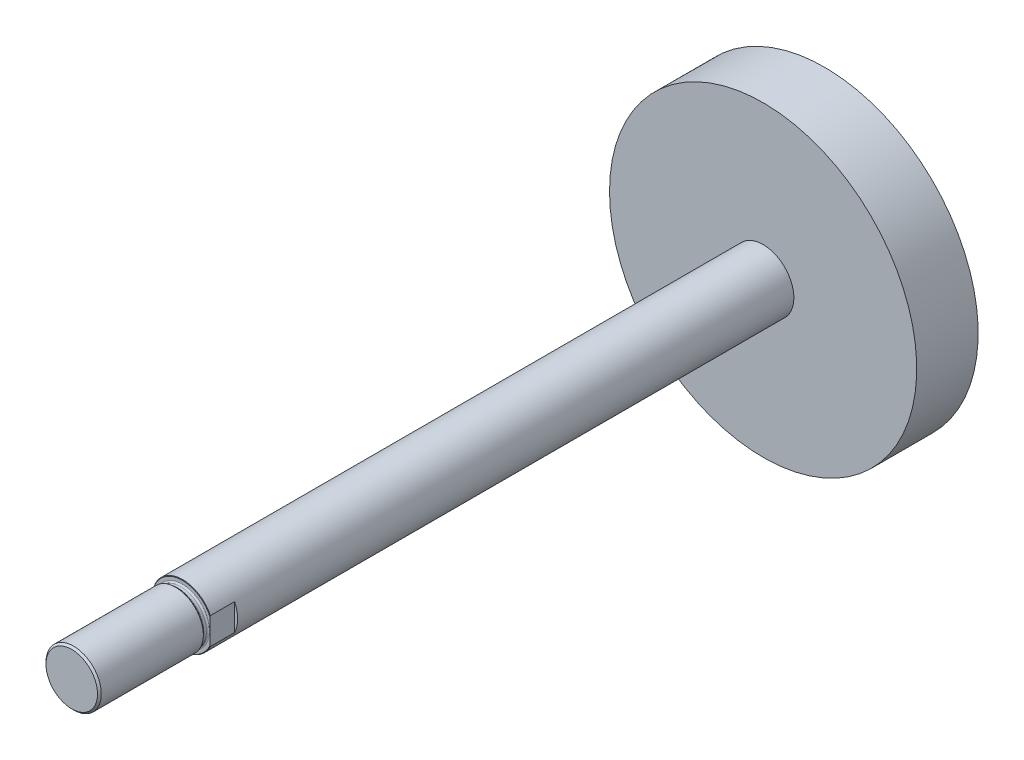
ISO-10303-21;
HEADER;
FILE_DESCRIPTION(('STEP AP214'),'2;1');
FILE_NAME('part.step','',(''),(''),'','','');
FILE_SCHEMA(('AUTOMOTIVE_DESIGN { 1 0 10303 214 1 1 1 1 }'));
ENDSEC;
DATA;
#1=APPLICATION_CONTEXT('core data for automotive mechanical design processes');
#2=APPLICATION_PROTOCOL_DEFINITION('international standard','automotive_design',2000,#1);
#3=PRODUCT_CONTEXT('',#1,'mechanical');
#4=PRODUCT('Part','Part','',(#3));
#5=PRODUCT_RELATED_PRODUCT_CATEGORY('part','',(#4));
#6=PRODUCT_DEFINITION_FORMATION('','',#4);
#7=PRODUCT_DEFINITION_CONTEXT('part definition',#1,'design');
#8=PRODUCT_DEFINITION('design','',#6,#7);
#9=PRODUCT_DEFINITION_SHAPE('','',#8);
#10=(LENGTH_UNIT() NAMED_UNIT(*) SI_UNIT(.MILLI.,.METRE.));
#11=(NAMED_UNIT(*) PLANE_ANGLE_UNIT() SI_UNIT($,.RADIAN.));
#12=(NAMED_UNIT(*) SI_UNIT($,.STERADIAN.) SOLID_ANGLE_UNIT());
#13=UNCERTAINTY_MEASURE_WITH_UNIT(LENGTH_MEASURE(1.E-05),#10,'distance_accuracy_value','');
#14=(GEOMETRIC_REPRESENTATION_CONTEXT(3) GLOBAL_UNCERTAINTY_ASSIGNED_CONTEXT((#13)) GLOBAL_UNIT_ASSIGNED_CONTEXT((#10,
#11,#12)) REPRESENTATION_CONTEXT('',''));
#15=CARTESIAN_POINT('',(0.,0.,0.));
#16=DIRECTION('',(0.,0.,1.));
#17=DIRECTION('',(1.,0.,0.));
#18=AXIS2_PLACEMENT_3D('',#15,#16,#17);
#19=CARTESIAN_POINT('',(0.,0.,95.));
#20=DIRECTION('',(0.,0.,-1.));
#21=DIRECTION('',(-1.,0.,0.));
#22=AXIS2_PLACEMENT_3D('',#19,#20,#21);
#23=PLANE('',#22);
#24=CARTESIAN_POINT('',(0.,0.,95.));
#25=DIRECTION('',(0.,0.,-1.));
#26=DIRECTION('',(-0.912910504162208,0.408159786591359,0.));
#27=AXIS2_PLACEMENT_3D('',#24,#25,#26);
#28=CIRCLE('',#27,19.717157287525);
#29=CARTESIAN_POINT('',(-18.,8.04775071066446,95.));
#30=VERTEX_POINT('',#29);
#31=CARTESIAN_POINT('',(18.,8.04775071066448,95.));
#32=VERTEX_POINT('',#31);
#33=EDGE_CURVE('E82',#30,#32,#28,.T.);
#34=ORIENTED_EDGE('',*,*,#33,.F.);
#35=DIRECTION('',(0.,1.,0.));
#36=VECTOR('',#35,1.);
#37=CARTESIAN_POINT('',(-18.,-8.04775071066448,95.));
#38=LINE('',#37,#36);
#39=CARTESIAN_POINT('',(-18.,-8.04775071066448,95.));
#40=VERTEX_POINT('',#39);
#41=EDGE_CURVE('E68',#40,#30,#38,.T.);
#42=ORIENTED_EDGE('',*,*,#41,.F.);
#43=CARTESIAN_POINT('',(0.,0.,95.));
#44=DIRECTION('',(0.,0.,-1.));
#45=DIRECTION('',(0.912910504162208,-0.408159786591359,0.));
#46=AXIS2_PLACEMENT_3D('',#43,#44,#45);
#47=CIRCLE('',#46,19.717157287525);
#48=CARTESIAN_POINT('',(18.,-8.04775071066446,95.));
#49=VERTEX_POINT('',#48);
#50=EDGE_CURVE('E81',#49,#40,#47,.T.);
#51=ORIENTED_EDGE('',*,*,#50,.F.);
#52=DIRECTION('',(0.,-1.,0.));
#53=VECTOR('',#52,1.);
#54=CARTESIAN_POINT('',(18.,8.04775071066448,95.));
#55=LINE('',#54,#53);
#56=EDGE_CURVE('E97',#32,#49,#55,.T.);
#57=ORIENTED_EDGE('',*,*,#56,.F.);
#58=EDGE_LOOP('',(#34,#42,#51,#57));
#59=FACE_BOUND('',#58,.T.);
#60=CARTESIAN_POINT('',(0.,0.,95.));
#61=DIRECTION('',(0.,0.,-1.));
#62=DIRECTION('',(-1.,0.,0.));
#63=AXIS2_PLACEMENT_3D('',#60,#61,#62);
#64=CIRCLE('',#63,17.6499999999985);
#65=CARTESIAN_POINT('',(-17.6499999999985,0.,95.));
#66=VERTEX_POINT('',#65);
#67=EDGE_CURVE('E92',#66,#66,#64,.T.);
#68=ORIENTED_EDGE('',*,*,#67,.T.);
#69=EDGE_LOOP('',(#68));
#70=FACE_BOUND('',#69,.T.);
#71=ADVANCED_FACE('F17',(#59,#70),#23,.F.);
#72=CARTESIAN_POINT('',(0.,0.,95.));
#73=DIRECTION('',(0.,0.,-1.));
#74=DIRECTION('',(-1.,0.,0.));
#75=AXIS2_PLACEMENT_3D('',#72,#73,#74);
#76=CONICAL_SURFACE('',#75,19.717157287525,0.785398163397491);
#77=CARTESIAN_POINT('',(-18.,8.0477505320324,95.0000000729104));
#78=CARTESIAN_POINT('',(-18.,8.15996603409676,94.9541982183829));
#79=CARTESIAN_POINT('',(-18.,8.27188164900305,94.907720703334));
#80=CARTESIAN_POINT('',(-18.,8.49523195706759,94.8134210108267));
#81=CARTESIAN_POINT('',(-18.,8.60665875609572,94.7656017115889));
#82=CARTESIAN_POINT('',(-18.,8.71779788707502,94.7171572875278));
#83=B_SPLINE_CURVE_WITH_KNOTS('',3,(#77,#78,#79,#80,#81,#82),.UNSPECIFIED.,.F.,.F.,(4,2,4),
(17.1788674085717,17.5369804556735,17.8950935027753),.UNSPECIFIED.);
#84=CARTESIAN_POINT('',(-18.,8.71779788708134,94.717157287525));
#85=VERTEX_POINT('',#84);
#86=EDGE_CURVE('E72',#30,#85,#83,.T.);
#87=ORIENTED_EDGE('',*,*,#86,.F.);
#88=ORIENTED_EDGE('',*,*,#33,.T.);
#89=CARTESIAN_POINT('',(18.,8.71779788697978,94.7171572875693));
#90=CARTESIAN_POINT('',(18.,8.60657467971762,94.7656383596321));
#91=CARTESIAN_POINT('',(18.,8.49497885263039,94.8135290430022));
#92=CARTESIAN_POINT('',(18.,8.27162780382397,94.9078267053341));
#93=CARTESIAN_POINT('',(18.,8.15988131627992,94.954232795377));
#94=CARTESIAN_POINT('',(18.,8.04775082978816,94.9999999513785));
#95=B_SPLINE_CURVE_WITH_KNOTS('',3,(#89,#90,#91,#92,#93,#94),.UNSPECIFIED.,.F.,.F.,(4,2,4),
(0.00172784369900691,0.36108497329147,0.720442102883933),.UNSPECIFIED.);
#96=CARTESIAN_POINT('',(18.,8.71779788708134,94.717157287525));
#97=VERTEX_POINT('',#96);
#98=EDGE_CURVE('E91',#97,#32,#95,.T.);
#99=ORIENTED_EDGE('',*,*,#98,.F.);
#100=CARTESIAN_POINT('',(0.,0.,94.717157287525));
#101=DIRECTION('',(0.,0.,-1.));
#102=DIRECTION('',(-0.9,0.435889894354067,0.));
#103=AXIS2_PLACEMENT_3D('',#100,#101,#102);
#104=CIRCLE('',#103,20.);
#105=EDGE_CURVE('E90',#85,#97,#104,.T.);
#106=ORIENTED_EDGE('',*,*,#105,.F.);
#107=EDGE_LOOP('',(#87,#88,#99,#106));
#108=FACE_BOUND('',#107,.T.);
#109=ADVANCED_FACE('F88',(#108),#76,.T.);
#110=CARTESIAN_POINT('',(-18.,36.,111.));
#111=DIRECTION('',(-1.,0.,0.));
#112=DIRECTION('',(0.,0.,1.));
#113=AXIS2_PLACEMENT_3D('',#110,#111,#112);
#114=PLANE('',#113);
#115=DIRECTION('',(0.,0.,-1.));
#116=VECTOR('',#115,1.);
#117=CARTESIAN_POINT('',(-18.,8.71779788708134,94.717157287525));
#118=LINE('',#117,#116);
#119=CARTESIAN_POINT('',(-18.,8.71779788708134,79.));
#120=VERTEX_POINT('',#119);
#121=EDGE_CURVE('E213',#85,#120,#118,.T.);
#122=ORIENTED_EDGE('',*,*,#121,.T.);
#123=DIRECTION('',(0.,-1.,0.));
#124=VECTOR('',#123,1.);
#125=CARTESIAN_POINT('',(-18.,8.71779788708134,79.));
#126=LINE('',#125,#124);
#127=CARTESIAN_POINT('',(-18.,-8.71779788708134,79.));
#128=VERTEX_POINT('',#127);
#129=EDGE_CURVE('E209',#120,#128,#126,.T.);
#130=ORIENTED_EDGE('',*,*,#129,.T.);
#131=DIRECTION('',(0.,0.,1.));
#132=VECTOR('',#131,1.);
#133=CARTESIAN_POINT('',(-18.,-8.71779788708134,79.));
#134=LINE('',#133,#132);
#135=CARTESIAN_POINT('',(-18.,-8.71779788708134,94.717157287525));
#136=VERTEX_POINT('',#135);
#137=EDGE_CURVE('E208',#128,#136,#134,.T.);
#138=ORIENTED_EDGE('',*,*,#137,.T.);
#139=CARTESIAN_POINT('',(-18.,-8.71779788697977,94.7171572875693));
#140=CARTESIAN_POINT('',(-18.,-8.60657467971763,94.7656383596321));
#141=CARTESIAN_POINT('',(-18.,-8.4949788526304,94.8135290430022));
#142=CARTESIAN_POINT('',(-18.,-8.271627803824,94.9078267053341));
#143=CARTESIAN_POINT('',(-18.,-8.15988131627995,94.954232795377));
#144=CARTESIAN_POINT('',(-18.,-8.0477508297882,94.9999999513785));
#145=B_SPLINE_CURVE_WITH_KNOTS('',3,(#139,#140,#141,#142,#143,#144),.UNSPECIFIED.,.F.,.F.,(4,2,
4),(0.00172784369900691,0.361084973291459,0.72044210288391),.UNSPECIFIED.);
#146=EDGE_CURVE('E76',#136,#40,#145,.T.);
#147=ORIENTED_EDGE('',*,*,#146,.T.);
#148=ORIENTED_EDGE('',*,*,#41,.T.);
#149=ORIENTED_EDGE('',*,*,#86,.T.);
#150=EDGE_LOOP('',(#122,#130,#138,#147,#148,#149));
#151=FACE_BOUND('',#150,.T.);
#152=ADVANCED_FACE('F71',(#151),#114,.T.);
#153=CARTESIAN_POINT('',(18.,-8.0477505320324,95.0000000729104));
#154=CARTESIAN_POINT('',(18.,-8.15996603409676,94.9541982183829));
#155=CARTESIAN_POINT('',(18.,-8.27188164900305,94.907720703334));
#156=CARTESIAN_POINT('',(18.,-8.49523195706758,94.8134210108267));
#157=CARTESIAN_POINT('',(18.,-8.60665875609571,94.7656017115889));
#158=CARTESIAN_POINT('',(18.,-8.71779788707502,94.7171572875278));
#159=B_SPLINE_CURVE_WITH_KNOTS('',3,(#153,#154,#155,#156,#157,#158),.UNSPECIFIED.,.F.,.F.,(4,2,
4),(17.1788674085717,17.5369804556735,17.8950935027753),.UNSPECIFIED.);
#160=CARTESIAN_POINT('',(18.,-8.71779788708134,94.717157287525));
#161=VERTEX_POINT('',#160);
#162=EDGE_CURVE('E207',#49,#161,#159,.T.);
#163=ORIENTED_EDGE('',*,*,#162,.F.);
#164=ORIENTED_EDGE('',*,*,#50,.T.);
#165=ORIENTED_EDGE('',*,*,#146,.F.);
#166=CARTESIAN_POINT('',(0.,0.,94.717157287525));
#167=DIRECTION('',(0.,0.,-1.));
#168=DIRECTION('',(0.9,-0.435889894354067,0.));
#169=AXIS2_PLACEMENT_3D('',#166,#167,#168);
#170=CIRCLE('',#169,20.);
#171=EDGE_CURVE('E205',#161,#136,#170,.T.);
#172=ORIENTED_EDGE('',*,*,#171,.F.);
#173=EDGE_LOOP('',(#163,#164,#165,#172));
#174=FACE_BOUND('',#173,.T.);
#175=ADVANCED_FACE('F176',(#174),#76,.T.);
#176=CARTESIAN_POINT('',(18.,36.,79.));
#177=DIRECTION('',(1.,0.,0.));
#178=DIRECTION('',(0.,0.,-1.));
#179=AXIS2_PLACEMENT_3D('',#176,#177,#178);
#180=PLANE('',#179);
#181=DIRECTION('',(0.,0.,-1.));
#182=VECTOR('',#181,1.);
#183=CARTESIAN_POINT('',(18.,-8.71779788708134,94.717157287525));
#184=LINE('',#183,#182);
#185=CARTESIAN_POINT('',(18.,-8.71779788708135,79.));
#186=VERTEX_POINT('',#185);
#187=EDGE_CURVE('E493',#161,#186,#184,.T.);
#188=ORIENTED_EDGE('',*,*,#187,.T.);
#189=DIRECTION('',(0.,-1.,0.));
#190=VECTOR('',#189,1.);
#191=CARTESIAN_POINT('',(18.,8.71779788708134,79.));
#192=LINE('',#191,#190);
#193=CARTESIAN_POINT('',(18.,8.71779788708134,79.));
#194=VERTEX_POINT('',#193);
#195=EDGE_CURVE('E34',#194,#186,#192,.T.);
#196=ORIENTED_EDGE('',*,*,#195,.F.);
#197=DIRECTION('',(0.,0.,1.));
#198=VECTOR('',#197,1.);
#199=CARTESIAN_POINT('',(18.,8.71779788708134,79.));
#200=LINE('',#199,#198);
#201=EDGE_CURVE('E123',#194,#97,#200,.T.);
#202=ORIENTED_EDGE('',*,*,#201,.T.);
#203=ORIENTED_EDGE('',*,*,#98,.T.);
#204=ORIENTED_EDGE('',*,*,#56,.T.);
#205=ORIENTED_EDGE('',*,*,#162,.T.);
#206=EDGE_LOOP('',(#188,#196,#202,#203,#204,#205));
#207=FACE_BOUND('',#206,.T.);
#208=ADVANCED_FACE('F116',(#207),#180,.T.);
#209=CARTESIAN_POINT('',(0.,0.,95.9999999999985));
#210=DIRECTION('',(0.,0.,-1.));
#211=DIRECTION('',(-1.,0.,0.));
#212=AXIS2_PLACEMENT_3D('',#209,#210,#211);
#213=TOROIDAL_SURFACE('',#212,17.6499999999985,0.999999999998474);
#214=ORIENTED_EDGE('',*,*,#67,.F.);
#215=EDGE_LOOP('',(#214));
#216=FACE_BOUND('',#215,.T.);
#217=CARTESIAN_POINT('',(0.,0.,96.));
#218=DIRECTION('',(0.,0.,-1.));
#219=DIRECTION('',(-1.,0.,0.));
#220=AXIS2_PLACEMENT_3D('',#217,#218,#219);
#221=CIRCLE('',#220,16.65);
#222=CARTESIAN_POINT('',(-16.65,0.,96.));
#223=VERTEX_POINT('',#222);
#224=EDGE_CURVE('E120',#223,#223,#221,.T.);
#225=ORIENTED_EDGE('',*,*,#224,.T.);
#226=EDGE_LOOP('',(#225));
#227=FACE_BOUND('',#226,.T.);
#228=ADVANCED_FACE('F112',(#216,#227),#213,.F.);
#229=CARTESIAN_POINT('',(0.,0.,-323.1));
#230=DIRECTION('',(0.,0.,-1.));
#231=DIRECTION('',(-1.,0.,0.));
#232=AXIS2_PLACEMENT_3D('',#229,#230,#231);
#233=CYLINDRICAL_SURFACE('',#232,20.);
#234=CARTESIAN_POINT('',(0.,0.,-283.1));
#235=DIRECTION('',(0.,0.,-1.));
#236=DIRECTION('',(-1.,0.,0.));
#237=AXIS2_PLACEMENT_3D('',#234,#235,#236);
#238=CIRCLE('',#237,20.);
#239=CARTESIAN_POINT('',(-20.,0.,-283.1));
#240=VERTEX_POINT('',#239);
#241=EDGE_CURVE('E122',#240,#240,#238,.T.);
#242=ORIENTED_EDGE('',*,*,#241,.F.);
#243=EDGE_LOOP('',(#242));
#244=FACE_BOUND('',#243,.T.);
#245=ORIENTED_EDGE('',*,*,#187,.F.);
#246=ORIENTED_EDGE('',*,*,#171,.T.);
#247=ORIENTED_EDGE('',*,*,#137,.F.);
#248=CARTESIAN_POINT('',(0.,0.,79.));
#249=DIRECTION('',(0.,0.,1.));
#250=DIRECTION('',(-0.9,0.435889894354067,0.));
#251=AXIS2_PLACEMENT_3D('',#248,#249,#250);
#252=CIRCLE('',#251,20.);
#253=EDGE_CURVE('E126',#120,#128,#252,.T.);
#254=ORIENTED_EDGE('',*,*,#253,.F.);
#255=ORIENTED_EDGE('',*,*,#121,.F.);
#256=ORIENTED_EDGE('',*,*,#105,.T.);
#257=ORIENTED_EDGE('',*,*,#201,.F.);
#258=CARTESIAN_POINT('',(0.,0.,79.));
#259=DIRECTION('',(0.,0.,1.));
#260=DIRECTION('',(0.9,-0.435889894354068,0.));
#261=AXIS2_PLACEMENT_3D('',#258,#259,#260);
#262=CIRCLE('',#261,20.);
#263=EDGE_CURVE('E31',#186,#194,#262,.T.);
#264=ORIENTED_EDGE('',*,*,#263,.F.);
#265=EDGE_LOOP('',(#245,#246,#247,#254,#255,#256,#257,#264));
#266=FACE_BOUND('',#265,.T.);
#267=ADVANCED_FACE('F115',(#244,#266),#233,.T.);
#268=CARTESIAN_POINT('',(-18.,36.,79.));
#269=DIRECTION('',(0.,0.,1.));
#270=DIRECTION('',(1.,0.,0.));
#271=AXIS2_PLACEMENT_3D('',#268,#269,#270);
#272=PLANE('',#271);
#273=ORIENTED_EDGE('',*,*,#253,.T.);
#274=ORIENTED_EDGE('',*,*,#129,.F.);
#275=EDGE_LOOP('',(#273,#274));
#276=FACE_BOUND('',#275,.T.);
#277=ADVANCED_FACE('F267',(#276),#272,.T.);
#278=CARTESIAN_POINT('',(36.,36.,79.));
#279=DIRECTION('',(0.,0.,1.));
#280=DIRECTION('',(1.,0.,0.));
#281=AXIS2_PLACEMENT_3D('',#278,#279,#280);
#282=PLANE('',#281);
#283=ORIENTED_EDGE('',*,*,#263,.T.);
#284=ORIENTED_EDGE('',*,*,#195,.T.);
#285=EDGE_LOOP('',(#283,#284));
#286=FACE_BOUND('',#285,.T.);
#287=ADVANCED_FACE('F271',(#286),#282,.T.);
#288=CARTESIAN_POINT('',(0.,0.,94.));
#289=DIRECTION('',(0.,0.,-1.));
#290=DIRECTION('',(-1.,0.,0.));
#291=AXIS2_PLACEMENT_3D('',#288,#289,#290);
#292=CYLINDRICAL_SURFACE('',#291,16.65);
#293=ORIENTED_EDGE('',*,*,#224,.F.);
#294=EDGE_LOOP('',(#293));
#295=FACE_BOUND('',#294,.T.);
#296=CARTESIAN_POINT('',(0.,0.,97.585786437627));
#297=DIRECTION('',(0.,0.,-1.));
#298=DIRECTION('',(-1.,0.,0.));
#299=AXIS2_PLACEMENT_3D('',#296,#297,#298);
#300=CIRCLE('',#299,16.65);
#301=CARTESIAN_POINT('',(-16.65,0.,97.585786437627));
#302=VERTEX_POINT('',#301);
#303=EDGE_CURVE('E140',#302,#302,#300,.T.);
#304=ORIENTED_EDGE('',*,*,#303,.T.);
#305=EDGE_LOOP('',(#304));
#306=FACE_BOUND('',#305,.T.);
#307=ADVANCED_FACE('F275',(#295,#306),#292,.T.);
#308=CARTESIAN_POINT('',(0.,20.,-283.1));
#309=DIRECTION('',(0.,0.,-1.));
#310=DIRECTION('',(-1.,0.,0.));
#311=AXIS2_PLACEMENT_3D('',#308,#309,#310);
#312=PLANE('',#311);
#313=CARTESIAN_POINT('',(0.,0.,-283.1));
#314=DIRECTION('',(0.,0.,-1.));
#315=DIRECTION('',(-1.,0.,0.));
#316=AXIS2_PLACEMENT_3D('',#313,#314,#315);
#317=CIRCLE('',#316,100.);
#318=CARTESIAN_POINT('',(-100.,0.,-283.1));
#319=VERTEX_POINT('',#318);
#320=EDGE_CURVE('E145',#319,#319,#317,.T.);
#321=ORIENTED_EDGE('',*,*,#320,.F.);
#322=EDGE_LOOP('',(#321));
#323=FACE_BOUND('',#322,.T.);
#324=ORIENTED_EDGE('',*,*,#241,.T.);
#325=EDGE_LOOP('',(#324));
#326=FACE_BOUND('',#325,.T.);
#327=ADVANCED_FACE('F278',(#323,#326),#312,.F.);
#328=CARTESIAN_POINT('',(0.,0.,97.5857864376256));
#329=DIRECTION('',(0.,0.,-1.));
#330=DIRECTION('',(-1.,0.,0.));
#331=AXIS2_PLACEMENT_3D('',#328,#329,#330);
#332=TOROIDAL_SURFACE('',#331,17.6500000000031,1.00000000000312);
#333=ORIENTED_EDGE('',*,*,#303,.F.);
#334=EDGE_LOOP('',(#333));
#335=FACE_BOUND('',#334,.T.);
#336=CARTESIAN_POINT('',(0.,0.,98.292893218813));
#337=DIRECTION('',(0.,0.,-1.));
#338=DIRECTION('',(-1.,0.,0.));
#339=AXIS2_PLACEMENT_3D('',#336,#337,#338);
#340=CIRCLE('',#339,16.942893218813);
#341=CARTESIAN_POINT('',(-16.942893218813,0.,98.292893218813));
#342=VERTEX_POINT('',#341);
#343=EDGE_CURVE('E148',#342,#342,#340,.T.);
#344=ORIENTED_EDGE('',*,*,#343,.T.);
#345=EDGE_LOOP('',(#344));
#346=FACE_BOUND('',#345,.T.);
#347=ADVANCED_FACE('F281',(#335,#346),#332,.F.);
#348=CARTESIAN_POINT('',(0.,0.,-323.1));
#349=DIRECTION('',(0.,0.,-1.));
#350=DIRECTION('',(-1.,0.,0.));
#351=AXIS2_PLACEMENT_3D('',#348,#349,#350);
#352=CYLINDRICAL_SURFACE('',#351,100.);
#353=CARTESIAN_POINT('',(0.,0.,-323.1));
#354=DIRECTION('',(0.,0.,-1.));
#355=DIRECTION('',(-1.,0.,0.));
#356=AXIS2_PLACEMENT_3D('',#353,#354,#355);
#357=CIRCLE('',#356,100.);
#358=CARTESIAN_POINT('',(-100.,0.,-323.1));
#359=VERTEX_POINT('',#358);
#360=EDGE_CURVE('E151',#359,#359,#357,.T.);
#361=ORIENTED_EDGE('',*,*,#360,.F.);
#362=EDGE_LOOP('',(#361));
#363=FACE_BOUND('',#362,.T.);
#364=ORIENTED_EDGE('',*,*,#320,.T.);
#365=EDGE_LOOP('',(#364));
#366=FACE_BOUND('',#365,.T.);
#367=ADVANCED_FACE('F285',(#363,#366),#352,.T.);
#368=CARTESIAN_POINT('',(0.,0.,99.35));
#369=DIRECTION('',(0.,0.,1.));
#370=DIRECTION('',(1.,0.,0.));
#371=AXIS2_PLACEMENT_3D('',#368,#369,#370);
#372=CONICAL_SURFACE('',#371,18.,0.785398163397452);
#373=ORIENTED_EDGE('',*,*,#343,.F.);
#374=EDGE_LOOP('',(#373));
#375=FACE_BOUND('',#374,.T.);
#376=CARTESIAN_POINT('',(0.,0.,99.35));
#377=DIRECTION('',(0.,0.,-1.));
#378=DIRECTION('',(-1.,0.,0.));
#379=AXIS2_PLACEMENT_3D('',#376,#377,#378);
#380=CIRCLE('',#379,18.);
#381=CARTESIAN_POINT('',(-18.,0.,99.35));
#382=VERTEX_POINT('',#381);
#383=EDGE_CURVE('E154',#382,#382,#380,.T.);
#384=ORIENTED_EDGE('',*,*,#383,.T.);
#385=EDGE_LOOP('',(#384));
#386=FACE_BOUND('',#385,.T.);
#387=ADVANCED_FACE('F289',(#375,#386),#372,.T.);
#388=CARTESIAN_POINT('',(0.,100.,-323.1));
#389=DIRECTION('',(0.,0.,1.));
#390=DIRECTION('',(1.,0.,0.));
#391=AXIS2_PLACEMENT_3D('',#388,#389,#390);
#392=PLANE('',#391);
#393=ORIENTED_EDGE('',*,*,#360,.T.);
#394=EDGE_LOOP('',(#393));
#395=FACE_BOUND('',#394,.T.);
#396=ADVANCED_FACE('F293',(#395),#392,.F.);
#397=CARTESIAN_POINT('',(0.,0.,94.));
#398=DIRECTION('',(0.,0.,-1.));
#399=DIRECTION('',(-1.,0.,0.));
#400=AXIS2_PLACEMENT_3D('',#397,#398,#399);
#401=CYLINDRICAL_SURFACE('',#400,18.);
#402=ORIENTED_EDGE('',*,*,#383,.F.);
#403=EDGE_LOOP('',(#402));
#404=FACE_BOUND('',#403,.T.);
#405=CARTESIAN_POINT('',(0.,0.,165.773));
#406=DIRECTION('',(0.,0.,-1.));
#407=DIRECTION('',(-1.,0.,0.));
#408=AXIS2_PLACEMENT_3D('',#405,#406,#407);
#409=CIRCLE('',#408,18.);
#410=CARTESIAN_POINT('',(-18.,0.,165.773));
#411=VERTEX_POINT('',#410);
#412=EDGE_CURVE('E25',#411,#411,#409,.T.);
#413=ORIENTED_EDGE('',*,*,#412,.T.);
#414=EDGE_LOOP('',(#413));
#415=FACE_BOUND('',#414,.T.);
#416=ADVANCED_FACE('F159',(#404,#415),#401,.T.);
#417=CARTESIAN_POINT('',(0.,0.,167.));
#418=DIRECTION('',(0.,0.,-1.));
#419=DIRECTION('',(-1.,0.,0.));
#420=AXIS2_PLACEMENT_3D('',#417,#418,#419);
#421=CONICAL_SURFACE('',#420,16.773,0.785398163397446);
#422=ORIENTED_EDGE('',*,*,#412,.F.);
#423=EDGE_LOOP('',(#422));
#424=FACE_BOUND('',#423,.T.);
#425=CARTESIAN_POINT('',(0.,0.,167.));
#426=DIRECTION('',(0.,0.,-1.));
#427=DIRECTION('',(-1.,0.,0.));
#428=AXIS2_PLACEMENT_3D('',#425,#426,#427);
#429=CIRCLE('',#428,16.773);
#430=CARTESIAN_POINT('',(-16.773,0.,167.));
#431=VERTEX_POINT('',#430);
#432=EDGE_CURVE('E11',#431,#431,#429,.T.);
#433=ORIENTED_EDGE('',*,*,#432,.T.);
#434=EDGE_LOOP('',(#433));
#435=FACE_BOUND('',#434,.T.);
#436=ADVANCED_FACE('F161',(#424,#435),#421,.T.);
#437=CARTESIAN_POINT('',(0.,0.,167.));
#438=DIRECTION('',(0.,0.,-1.));
#439=DIRECTION('',(-1.,0.,0.));
#440=AXIS2_PLACEMENT_3D('',#437,#438,#439);
#441=PLANE('',#440);
#442=ORIENTED_EDGE('',*,*,#432,.F.);
#443=EDGE_LOOP('',(#442));
#444=FACE_BOUND('',#443,.T.);
#445=ADVANCED_FACE('F19',(#444),#441,.F.);
#446=CLOSED_SHELL('',(#71,#109,#152,#175,#208,#228,#267,#277,#287,#307,#327,#347,#367,#387,#396,
#416,#436,#445));
#447=MANIFOLD_SOLID_BREP('B1',#446);
#448=ADVANCED_BREP_SHAPE_REPRESENTATION('',(#18,#447),#14);
#449=SHAPE_DEFINITION_REPRESENTATION(#9,#448);
ENDSEC;
END-ISO-10303-21;
